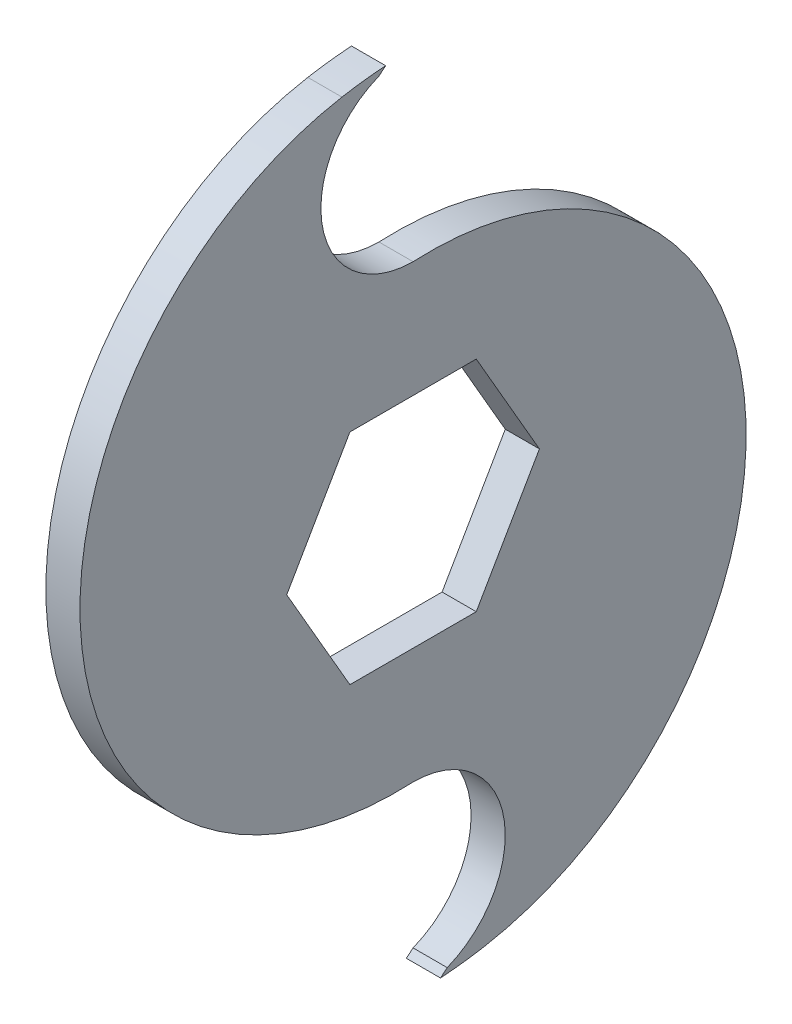
ISO-10303-21;
HEADER;
FILE_DESCRIPTION(('STEP AP214'),'2;1');
FILE_NAME('part.step','',(''),(''),'','','');
FILE_SCHEMA(('AUTOMOTIVE_DESIGN { 1 0 10303 214 1 1 1 1 }'));
ENDSEC;
DATA;
#1=APPLICATION_CONTEXT('core data for automotive mechanical design processes');
#2=APPLICATION_PROTOCOL_DEFINITION('international standard','automotive_design',2000,#1);
#3=PRODUCT_CONTEXT('',#1,'mechanical');
#4=PRODUCT('Part','Part','',(#3));
#5=PRODUCT_RELATED_PRODUCT_CATEGORY('part','',(#4));
#6=PRODUCT_DEFINITION_FORMATION('','',#4);
#7=PRODUCT_DEFINITION_CONTEXT('part definition',#1,'design');
#8=PRODUCT_DEFINITION('design','',#6,#7);
#9=PRODUCT_DEFINITION_SHAPE('','',#8);
#10=(LENGTH_UNIT() NAMED_UNIT(*) SI_UNIT(.MILLI.,.METRE.));
#11=(NAMED_UNIT(*) PLANE_ANGLE_UNIT() SI_UNIT($,.RADIAN.));
#12=(NAMED_UNIT(*) SI_UNIT($,.STERADIAN.) SOLID_ANGLE_UNIT());
#13=UNCERTAINTY_MEASURE_WITH_UNIT(LENGTH_MEASURE(1.E-05),#10,'distance_accuracy_value','');
#14=(GEOMETRIC_REPRESENTATION_CONTEXT(3) GLOBAL_UNCERTAINTY_ASSIGNED_CONTEXT((#13)) GLOBAL_UNIT_ASSIGNED_CONTEXT((#10,
#11,#12)) REPRESENTATION_CONTEXT('',''));
#15=CARTESIAN_POINT('',(0.,0.,0.));
#16=DIRECTION('',(0.,0.,1.));
#17=DIRECTION('',(1.,0.,0.));
#18=AXIS2_PLACEMENT_3D('',#15,#16,#17);
#19=CARTESIAN_POINT('',(5.,-6.68348162766741,-1.17847813602709));
#20=DIRECTION('',(1.,0.,0.));
#21=DIRECTION('',(0.,0.,-1.));
#22=AXIS2_PLACEMENT_3D('',#19,#20,#21);
#23=PLANE('',#22);
#24=CARTESIAN_POINT('',(5.,46.5,0.));
#25=DIRECTION('',(-1.,0.,0.));
#26=DIRECTION('',(0.,0.,-1.));
#27=AXIS2_PLACEMENT_3D('',#24,#25,#26);
#28=CIRCLE('',#27,13.5);
#29=CARTESIAN_POINT('',(5.,33.,0.));
#30=VERTEX_POINT('',#29);
#31=CARTESIAN_POINT('',(5.,59.0399362039844,5.00000000000001));
#32=VERTEX_POINT('',#31);
#33=EDGE_CURVE('E175',#30,#32,#28,.T.);
#34=ORIENTED_EDGE('',*,*,#33,.T.);
#35=DIRECTION('',(0.,0.642787609686539,-0.766044443118979));
#36=VECTOR('',#35,1.);
#37=CARTESIAN_POINT('',(5.,34.9269097415008,33.7367859149842));
#38=LINE('',#37,#36);
#39=CARTESIAN_POINT('',(5.,59.8654328102476,4.01621145381155));
#40=VERTEX_POINT('',#39);
#41=EDGE_CURVE('E164',#32,#40,#38,.T.);
#42=ORIENTED_EDGE('',*,*,#41,.T.);
#43=CARTESIAN_POINT('',(5.,0.,0.));
#44=DIRECTION('',(1.,0.,0.));
#45=DIRECTION('',(0.,0.,-1.));
#46=AXIS2_PLACEMENT_3D('',#43,#44,#45);
#47=CIRCLE('',#46,60.);
#48=CARTESIAN_POINT('',(5.,59.0884651807325,10.4188906600159));
#49=VERTEX_POINT('',#48);
#50=EDGE_CURVE('E178',#40,#49,#47,.T.);
#51=ORIENTED_EDGE('',*,*,#50,.T.);
#52=CARTESIAN_POINT('',(5.,13.3669632553348,2.3569562720542));
#53=DIRECTION('',(1.,0.,0.));
#54=DIRECTION('',(0.,0.,1.));
#55=AXIS2_PLACEMENT_3D('',#52,#53,#54);
#56=CIRCLE('',#55,46.4268297904341);
#57=CARTESIAN_POINT('',(5.,-33.,3.23881127922987E-13));
#58=VERTEX_POINT('',#57);
#59=EDGE_CURVE('E180',#49,#58,#56,.T.);
#60=ORIENTED_EDGE('',*,*,#59,.T.);
#61=CARTESIAN_POINT('',(5.,-46.5,3.24707764512411E-13));
#62=DIRECTION('',(-1.,0.,0.));
#63=DIRECTION('',(0.,0.,-1.));
#64=AXIS2_PLACEMENT_3D('',#61,#62,#63);
#65=CIRCLE('',#64,13.5);
#66=CARTESIAN_POINT('',(5.,-59.0399362039845,-4.99999999999959));
#67=VERTEX_POINT('',#66);
#68=EDGE_CURVE('E182',#58,#67,#65,.T.);
#69=ORIENTED_EDGE('',*,*,#68,.T.);
#70=DIRECTION('',(0.,-0.642787609686533,0.766044443118983));
#71=VECTOR('',#70,1.);
#72=CARTESIAN_POINT('',(5.,-39.2892425589387,-28.5379601077109));
#73=LINE('',#72,#71);
#74=CARTESIAN_POINT('',(5.,-59.8654328102477,-4.01621145381112));
#75=VERTEX_POINT('',#74);
#76=EDGE_CURVE('E158',#67,#75,#73,.T.);
#77=ORIENTED_EDGE('',*,*,#76,.T.);
#78=CARTESIAN_POINT('',(5.,0.,0.));
#79=DIRECTION('',(1.,0.,0.));
#80=DIRECTION('',(0.,0.,-1.));
#81=AXIS2_PLACEMENT_3D('',#78,#79,#80);
#82=CIRCLE('',#81,60.);
#83=CARTESIAN_POINT('',(5.,-59.0884651807325,-10.4188906600159));
#84=VERTEX_POINT('',#83);
#85=EDGE_CURVE('E170',#75,#84,#82,.T.);
#86=ORIENTED_EDGE('',*,*,#85,.T.);
#87=CARTESIAN_POINT('',(5.,-13.3669632553348,-2.35695627205419));
#88=DIRECTION('',(1.,0.,0.));
#89=DIRECTION('',(0.,0.,1.));
#90=AXIS2_PLACEMENT_3D('',#87,#88,#89);
#91=CIRCLE('',#90,46.4268297904341);
#92=EDGE_CURVE('E172',#84,#30,#91,.T.);
#93=ORIENTED_EDGE('',*,*,#92,.T.);
#94=EDGE_LOOP('',(#34,#42,#51,#60,#69,#77,#86,#93));
#95=FACE_BOUND('',#94,.T.);
#96=DIRECTION('',(0.,0.866025403784439,0.5));
#97=VECTOR('',#96,1.);
#98=CARTESIAN_POINT('',(5.,-13.5354072225526,10.6894051239956));
#99=LINE('',#98,#97);
#100=CARTESIAN_POINT('',(5.,-16.025,9.25203806376375));
#101=VERTEX_POINT('',#100);
#102=CARTESIAN_POINT('',(5.,0.,18.5040761275275));
#103=VERTEX_POINT('',#102);
#104=EDGE_CURVE('E149',#101,#103,#99,.T.);
#105=ORIENTED_EDGE('',*,*,#104,.T.);
#106=DIRECTION('',(0.,0.866025403784439,-0.5));
#107=VECTOR('',#106,1.);
#108=CARTESIAN_POINT('',(5.,3.51018478105142,16.4774699992821));
#109=LINE('',#108,#107);
#110=CARTESIAN_POINT('',(5.,16.025,9.25203806376373));
#111=VERTEX_POINT('',#110);
#112=EDGE_CURVE('E142',#103,#111,#109,.T.);
#113=ORIENTED_EDGE('',*,*,#112,.T.);
#114=DIRECTION('',(0.,0.,-1.));
#115=VECTOR('',#114,1.);
#116=CARTESIAN_POINT('',(5.,16.025,-1.17847813602709));
#117=LINE('',#116,#115);
#118=CARTESIAN_POINT('',(5.,16.025,-9.25203806376374));
#119=VERTEX_POINT('',#118);
#120=EDGE_CURVE('E131',#111,#119,#117,.T.);
#121=ORIENTED_EDGE('',*,*,#120,.T.);
#122=DIRECTION('',(0.,-0.866025403784439,-0.5));
#123=VECTOR('',#122,1.);
#124=CARTESIAN_POINT('',(5.,2.48959277744745,-17.0667090672957));
#125=LINE('',#124,#123);
#126=CARTESIAN_POINT('',(5.,0.,-18.5040761275275));
#127=VERTEX_POINT('',#126);
#128=EDGE_CURVE('E136',#119,#127,#125,.T.);
#129=ORIENTED_EDGE('',*,*,#128,.T.);
#130=DIRECTION('',(0.,-0.866025403784439,0.5));
#131=VECTOR('',#130,1.);
#132=CARTESIAN_POINT('',(5.,-12.5148152189486,-11.2786441920091));
#133=LINE('',#132,#131);
#134=CARTESIAN_POINT('',(5.,-16.025,-9.25203806376375));
#135=VERTEX_POINT('',#134);
#136=EDGE_CURVE('E245',#127,#135,#133,.T.);
#137=ORIENTED_EDGE('',*,*,#136,.T.);
#138=DIRECTION('',(0.,0.,1.));
#139=VECTOR('',#138,1.);
#140=CARTESIAN_POINT('',(5.,-16.025,-1.17847813602709));
#141=LINE('',#140,#139);
#142=EDGE_CURVE('E154',#135,#101,#141,.T.);
#143=ORIENTED_EDGE('',*,*,#142,.T.);
#144=EDGE_LOOP('',(#105,#113,#121,#129,#137,#143));
#145=FACE_BOUND('',#144,.T.);
#146=ADVANCED_FACE('F34',(#95,#145),#23,.T.);
#147=CARTESIAN_POINT('',(0.,-6.68348162766741,-1.17847813602709));
#148=DIRECTION('',(1.,0.,0.));
#149=DIRECTION('',(0.,0.,-1.));
#150=AXIS2_PLACEMENT_3D('',#147,#148,#149);
#151=PLANE('',#150);
#152=DIRECTION('',(0.,0.642787609686539,-0.766044443118979));
#153=VECTOR('',#152,1.);
#154=CARTESIAN_POINT('',(0.,34.9269097415008,33.7367859149842));
#155=LINE('',#154,#153);
#156=CARTESIAN_POINT('',(0.,59.0399362039845,5.));
#157=VERTEX_POINT('',#156);
#158=CARTESIAN_POINT('',(0.,59.8654328102476,4.01621145381154));
#159=VERTEX_POINT('',#158);
#160=EDGE_CURVE('E211',#157,#159,#155,.T.);
#161=ORIENTED_EDGE('',*,*,#160,.F.);
#162=CARTESIAN_POINT('',(0.,46.5,0.));
#163=DIRECTION('',(-1.,0.,0.));
#164=DIRECTION('',(0.,0.,-1.));
#165=AXIS2_PLACEMENT_3D('',#162,#163,#164);
#166=CIRCLE('',#165,13.5);
#167=CARTESIAN_POINT('',(0.,33.,0.));
#168=VERTEX_POINT('',#167);
#169=EDGE_CURVE('E189',#168,#157,#166,.T.);
#170=ORIENTED_EDGE('',*,*,#169,.F.);
#171=CARTESIAN_POINT('',(0.,-13.3669632553348,-2.35695627205419));
#172=DIRECTION('',(1.,0.,0.));
#173=DIRECTION('',(0.,0.,1.));
#174=AXIS2_PLACEMENT_3D('',#171,#172,#173);
#175=CIRCLE('',#174,46.4268297904341);
#176=CARTESIAN_POINT('',(0.,-59.0884651807325,-10.4188906600159));
#177=VERTEX_POINT('',#176);
#178=EDGE_CURVE('E187',#177,#168,#175,.T.);
#179=ORIENTED_EDGE('',*,*,#178,.F.);
#180=CARTESIAN_POINT('',(0.,0.,0.));
#181=DIRECTION('',(1.,0.,0.));
#182=DIRECTION('',(0.,0.,-1.));
#183=AXIS2_PLACEMENT_3D('',#180,#181,#182);
#184=CIRCLE('',#183,60.);
#185=CARTESIAN_POINT('',(0.,-59.8654328102476,-4.01621145381111));
#186=VERTEX_POINT('',#185);
#187=EDGE_CURVE('E169',#186,#177,#184,.T.);
#188=ORIENTED_EDGE('',*,*,#187,.F.);
#189=DIRECTION('',(0.,-0.642787609686533,0.766044443118983));
#190=VECTOR('',#189,1.);
#191=CARTESIAN_POINT('',(0.,-39.2892425589387,-28.5379601077109));
#192=LINE('',#191,#190);
#193=CARTESIAN_POINT('',(0.,-59.0399362039845,-4.99999999999958));
#194=VERTEX_POINT('',#193);
#195=EDGE_CURVE('E209',#194,#186,#192,.T.);
#196=ORIENTED_EDGE('',*,*,#195,.F.);
#197=CARTESIAN_POINT('',(0.,-46.5,3.24707764512411E-13));
#198=DIRECTION('',(-1.,0.,0.));
#199=DIRECTION('',(0.,0.,-1.));
#200=AXIS2_PLACEMENT_3D('',#197,#198,#199);
#201=CIRCLE('',#200,13.5);
#202=CARTESIAN_POINT('',(0.,-33.,3.23881127922987E-13));
#203=VERTEX_POINT('',#202);
#204=EDGE_CURVE('E173',#203,#194,#201,.T.);
#205=ORIENTED_EDGE('',*,*,#204,.F.);
#206=CARTESIAN_POINT('',(0.,13.3669632553348,2.3569562720542));
#207=DIRECTION('',(1.,0.,0.));
#208=DIRECTION('',(0.,0.,1.));
#209=AXIS2_PLACEMENT_3D('',#206,#207,#208);
#210=CIRCLE('',#209,46.4268297904341);
#211=CARTESIAN_POINT('',(0.,59.0884651807325,10.4188906600159));
#212=VERTEX_POINT('',#211);
#213=EDGE_CURVE('E194',#212,#203,#210,.T.);
#214=ORIENTED_EDGE('',*,*,#213,.F.);
#215=CARTESIAN_POINT('',(0.,0.,0.));
#216=DIRECTION('',(1.,0.,0.));
#217=DIRECTION('',(0.,0.,-1.));
#218=AXIS2_PLACEMENT_3D('',#215,#216,#217);
#219=CIRCLE('',#218,60.);
#220=EDGE_CURVE('E192',#159,#212,#219,.T.);
#221=ORIENTED_EDGE('',*,*,#220,.F.);
#222=EDGE_LOOP('',(#161,#170,#179,#188,#196,#205,#214,#221));
#223=FACE_BOUND('',#222,.T.);
#224=DIRECTION('',(0.,0.866025403784439,-0.5));
#225=VECTOR('',#224,1.);
#226=CARTESIAN_POINT('',(0.,3.51018478105142,16.4774699992821));
#227=LINE('',#226,#225);
#228=CARTESIAN_POINT('',(0.,0.,18.5040761275275));
#229=VERTEX_POINT('',#228);
#230=CARTESIAN_POINT('',(0.,16.025,9.25203806376373));
#231=VERTEX_POINT('',#230);
#232=EDGE_CURVE('E11',#229,#231,#227,.T.);
#233=ORIENTED_EDGE('',*,*,#232,.F.);
#234=DIRECTION('',(0.,0.866025403784439,0.5));
#235=VECTOR('',#234,1.);
#236=CARTESIAN_POINT('',(0.,-13.5354072225526,10.6894051239956));
#237=LINE('',#236,#235);
#238=CARTESIAN_POINT('',(0.,-16.025,9.25203806376375));
#239=VERTEX_POINT('',#238);
#240=EDGE_CURVE('E42',#239,#229,#237,.T.);
#241=ORIENTED_EDGE('',*,*,#240,.F.);
#242=DIRECTION('',(0.,0.,1.));
#243=VECTOR('',#242,1.);
#244=CARTESIAN_POINT('',(0.,-16.025,-1.17847813602709));
#245=LINE('',#244,#243);
#246=CARTESIAN_POINT('',(0.,-16.025,-9.25203806376375));
#247=VERTEX_POINT('',#246);
#248=EDGE_CURVE('E219',#247,#239,#245,.T.);
#249=ORIENTED_EDGE('',*,*,#248,.F.);
#250=DIRECTION('',(0.,-0.866025403784439,0.5));
#251=VECTOR('',#250,1.);
#252=CARTESIAN_POINT('',(0.,-12.5148152189486,-11.2786441920091));
#253=LINE('',#252,#251);
#254=CARTESIAN_POINT('',(0.,0.,-18.5040761275275));
#255=VERTEX_POINT('',#254);
#256=EDGE_CURVE('E217',#255,#247,#253,.T.);
#257=ORIENTED_EDGE('',*,*,#256,.F.);
#258=DIRECTION('',(0.,-0.866025403784439,-0.5));
#259=VECTOR('',#258,1.);
#260=CARTESIAN_POINT('',(0.,2.48959277744745,-17.0667090672957));
#261=LINE('',#260,#259);
#262=CARTESIAN_POINT('',(0.,16.025,-9.25203806376374));
#263=VERTEX_POINT('',#262);
#264=EDGE_CURVE('E215',#263,#255,#261,.T.);
#265=ORIENTED_EDGE('',*,*,#264,.F.);
#266=DIRECTION('',(0.,0.,-1.));
#267=VECTOR('',#266,1.);
#268=CARTESIAN_POINT('',(0.,16.025,-1.17847813602709));
#269=LINE('',#268,#267);
#270=EDGE_CURVE('E213',#231,#263,#269,.T.);
#271=ORIENTED_EDGE('',*,*,#270,.F.);
#272=EDGE_LOOP('',(#233,#241,#249,#257,#265,#271));
#273=FACE_BOUND('',#272,.T.);
#274=ADVANCED_FACE('F229',(#223,#273),#151,.F.);
#275=CARTESIAN_POINT('',(5.,0.,0.));
#276=DIRECTION('',(-1.,0.,0.));
#277=DIRECTION('',(0.,0.,1.));
#278=AXIS2_PLACEMENT_3D('',#275,#276,#277);
#279=CYLINDRICAL_SURFACE('',#278,60.);
#280=DIRECTION('',(-1.,0.,0.));
#281=VECTOR('',#280,1.);
#282=CARTESIAN_POINT('',(5.,-59.8654328102477,-4.01621145381108));
#283=LINE('',#282,#281);
#284=EDGE_CURVE('E162',#186,#75,#283,.F.);
#285=ORIENTED_EDGE('',*,*,#284,.F.);
#286=ORIENTED_EDGE('',*,*,#187,.T.);
#287=DIRECTION('',(-1.,0.,0.));
#288=VECTOR('',#287,1.);
#289=CARTESIAN_POINT('',(5.,-59.0884651807325,-10.4188906600159));
#290=LINE('',#289,#288);
#291=EDGE_CURVE('E206',#84,#177,#290,.T.);
#292=ORIENTED_EDGE('',*,*,#291,.F.);
#293=ORIENTED_EDGE('',*,*,#85,.F.);
#294=EDGE_LOOP('',(#285,#286,#292,#293));
#295=FACE_BOUND('',#294,.T.);
#296=ADVANCED_FACE('F36',(#295),#279,.T.);
#297=CARTESIAN_POINT('',(5.,46.5,0.));
#298=DIRECTION('',(-1.,0.,0.));
#299=DIRECTION('',(0.,0.,1.));
#300=AXIS2_PLACEMENT_3D('',#297,#298,#299);
#301=CYLINDRICAL_SURFACE('',#300,13.5);
#302=DIRECTION('',(-1.,0.,0.));
#303=VECTOR('',#302,1.);
#304=CARTESIAN_POINT('',(6.,59.0399362039844,5.00000000000001));
#305=LINE('',#304,#303);
#306=EDGE_CURVE('E152',#32,#157,#305,.T.);
#307=ORIENTED_EDGE('',*,*,#306,.F.);
#308=ORIENTED_EDGE('',*,*,#33,.F.);
#309=DIRECTION('',(-1.,0.,0.));
#310=VECTOR('',#309,1.);
#311=CARTESIAN_POINT('',(5.,33.,0.));
#312=LINE('',#311,#310);
#313=EDGE_CURVE('E203',#30,#168,#312,.T.);
#314=ORIENTED_EDGE('',*,*,#313,.T.);
#315=ORIENTED_EDGE('',*,*,#169,.T.);
#316=EDGE_LOOP('',(#307,#308,#314,#315));
#317=FACE_BOUND('',#316,.T.);
#318=ADVANCED_FACE('F285',(#317),#301,.F.);
#319=CARTESIAN_POINT('',(5.,0.,0.));
#320=DIRECTION('',(-1.,0.,0.));
#321=DIRECTION('',(0.,0.,1.));
#322=AXIS2_PLACEMENT_3D('',#319,#320,#321);
#323=CYLINDRICAL_SURFACE('',#322,60.);
#324=DIRECTION('',(-1.,0.,0.));
#325=VECTOR('',#324,1.);
#326=CARTESIAN_POINT('',(5.,59.8654328102476,4.01621145381155));
#327=LINE('',#326,#325);
#328=EDGE_CURVE('E167',#159,#40,#327,.F.);
#329=ORIENTED_EDGE('',*,*,#328,.F.);
#330=ORIENTED_EDGE('',*,*,#220,.T.);
#331=DIRECTION('',(-1.,0.,0.));
#332=VECTOR('',#331,1.);
#333=CARTESIAN_POINT('',(5.,59.0884651807325,10.4188906600159));
#334=LINE('',#333,#332);
#335=EDGE_CURVE('E200',#49,#212,#334,.T.);
#336=ORIENTED_EDGE('',*,*,#335,.F.);
#337=ORIENTED_EDGE('',*,*,#50,.F.);
#338=EDGE_LOOP('',(#329,#330,#336,#337));
#339=FACE_BOUND('',#338,.T.);
#340=ADVANCED_FACE('F277',(#339),#323,.T.);
#341=CARTESIAN_POINT('',(5.,-46.5,3.24707764512411E-13));
#342=DIRECTION('',(-1.,0.,0.));
#343=DIRECTION('',(0.,0.,1.));
#344=AXIS2_PLACEMENT_3D('',#341,#342,#343);
#345=CYLINDRICAL_SURFACE('',#344,13.5);
#346=DIRECTION('',(-1.,0.,0.));
#347=VECTOR('',#346,1.);
#348=CARTESIAN_POINT('',(6.,-59.0399362039845,-4.99999999999959));
#349=LINE('',#348,#347);
#350=EDGE_CURVE('E150',#67,#194,#349,.T.);
#351=ORIENTED_EDGE('',*,*,#350,.F.);
#352=ORIENTED_EDGE('',*,*,#68,.F.);
#353=DIRECTION('',(-1.,0.,0.));
#354=VECTOR('',#353,1.);
#355=CARTESIAN_POINT('',(5.,-33.,3.23881127922987E-13));
#356=LINE('',#355,#354);
#357=EDGE_CURVE('E185',#58,#203,#356,.T.);
#358=ORIENTED_EDGE('',*,*,#357,.T.);
#359=ORIENTED_EDGE('',*,*,#204,.T.);
#360=EDGE_LOOP('',(#351,#352,#358,#359));
#361=FACE_BOUND('',#360,.T.);
#362=ADVANCED_FACE('F273',(#361),#345,.F.);
#363=CARTESIAN_POINT('',(5.,-13.3669632553348,-2.35695627205419));
#364=DIRECTION('',(-1.,0.,0.));
#365=DIRECTION('',(0.,0.,1.));
#366=AXIS2_PLACEMENT_3D('',#363,#364,#365);
#367=CYLINDRICAL_SURFACE('',#366,46.4268297904341);
#368=ORIENTED_EDGE('',*,*,#178,.T.);
#369=ORIENTED_EDGE('',*,*,#313,.F.);
#370=ORIENTED_EDGE('',*,*,#92,.F.);
#371=ORIENTED_EDGE('',*,*,#291,.T.);
#372=EDGE_LOOP('',(#368,#369,#370,#371));
#373=FACE_BOUND('',#372,.T.);
#374=ADVANCED_FACE('F276',(#373),#367,.T.);
#375=CARTESIAN_POINT('',(5.,13.3669632553348,2.3569562720542));
#376=DIRECTION('',(-1.,0.,0.));
#377=DIRECTION('',(0.,0.,1.));
#378=AXIS2_PLACEMENT_3D('',#375,#376,#377);
#379=CYLINDRICAL_SURFACE('',#378,46.4268297904341);
#380=ORIENTED_EDGE('',*,*,#213,.T.);
#381=ORIENTED_EDGE('',*,*,#357,.F.);
#382=ORIENTED_EDGE('',*,*,#59,.F.);
#383=ORIENTED_EDGE('',*,*,#335,.T.);
#384=EDGE_LOOP('',(#380,#381,#382,#383));
#385=FACE_BOUND('',#384,.T.);
#386=ADVANCED_FACE('F279',(#385),#379,.T.);
#387=CARTESIAN_POINT('',(6.,-59.0399362039845,-4.99999999999959));
#388=DIRECTION('',(0.,0.766044443118983,0.642787609686533));
#389=DIRECTION('',(0.,-0.642787609686533,0.766044443118983));
#390=AXIS2_PLACEMENT_3D('',#387,#388,#389);
#391=PLANE('',#390);
#392=ORIENTED_EDGE('',*,*,#284,.T.);
#393=ORIENTED_EDGE('',*,*,#76,.F.);
#394=ORIENTED_EDGE('',*,*,#350,.T.);
#395=ORIENTED_EDGE('',*,*,#195,.T.);
#396=EDGE_LOOP('',(#392,#393,#394,#395));
#397=FACE_BOUND('',#396,.T.);
#398=ADVANCED_FACE('F270',(#397),#391,.T.);
#399=CARTESIAN_POINT('',(6.,59.0399362039844,5.00000000000001));
#400=DIRECTION('',(0.,-0.766044443118979,-0.642787609686539));
#401=DIRECTION('',(0.,0.642787609686539,-0.766044443118979));
#402=AXIS2_PLACEMENT_3D('',#399,#400,#401);
#403=PLANE('',#402);
#404=ORIENTED_EDGE('',*,*,#328,.T.);
#405=ORIENTED_EDGE('',*,*,#41,.F.);
#406=ORIENTED_EDGE('',*,*,#306,.T.);
#407=ORIENTED_EDGE('',*,*,#160,.T.);
#408=EDGE_LOOP('',(#404,#405,#406,#407));
#409=FACE_BOUND('',#408,.T.);
#410=ADVANCED_FACE('F306',(#409),#403,.T.);
#411=CARTESIAN_POINT('',(148.5,16.025,9.25203806376373));
#412=DIRECTION('',(0.,-0.5,-0.866025403784439));
#413=DIRECTION('',(0.,0.866025403784439,-0.5));
#414=AXIS2_PLACEMENT_3D('',#411,#412,#413);
#415=PLANE('',#414);
#416=DIRECTION('',(-1.,0.,0.));
#417=VECTOR('',#416,1.);
#418=CARTESIAN_POINT('',(148.5,0.,18.5040761275275));
#419=LINE('',#418,#417);
#420=EDGE_CURVE('E137',#103,#229,#419,.T.);
#421=ORIENTED_EDGE('',*,*,#420,.T.);
#422=ORIENTED_EDGE('',*,*,#232,.T.);
#423=DIRECTION('',(-1.,0.,0.));
#424=VECTOR('',#423,1.);
#425=CARTESIAN_POINT('',(148.5,16.025,9.25203806376373));
#426=LINE('',#425,#424);
#427=EDGE_CURVE('E54',#111,#231,#426,.T.);
#428=ORIENTED_EDGE('',*,*,#427,.F.);
#429=ORIENTED_EDGE('',*,*,#112,.F.);
#430=EDGE_LOOP('',(#421,#422,#428,#429));
#431=FACE_BOUND('',#430,.T.);
#432=ADVANCED_FACE('F141',(#431),#415,.T.);
#433=CARTESIAN_POINT('',(148.5,0.,18.5040761275275));
#434=DIRECTION('',(0.,0.5,-0.866025403784439));
#435=DIRECTION('',(0.,0.866025403784439,0.5));
#436=AXIS2_PLACEMENT_3D('',#433,#434,#435);
#437=PLANE('',#436);
#438=DIRECTION('',(-1.,0.,0.));
#439=VECTOR('',#438,1.);
#440=CARTESIAN_POINT('',(148.5,-16.025,9.25203806376375));
#441=LINE('',#440,#439);
#442=EDGE_CURVE('E225',#101,#239,#441,.T.);
#443=ORIENTED_EDGE('',*,*,#442,.T.);
#444=ORIENTED_EDGE('',*,*,#240,.T.);
#445=ORIENTED_EDGE('',*,*,#420,.F.);
#446=ORIENTED_EDGE('',*,*,#104,.F.);
#447=EDGE_LOOP('',(#443,#444,#445,#446));
#448=FACE_BOUND('',#447,.T.);
#449=ADVANCED_FACE('F223',(#448),#437,.T.);
#450=CARTESIAN_POINT('',(148.5,-16.025,9.25203806376375));
#451=DIRECTION('',(0.,1.,0.));
#452=DIRECTION('',(0.,0.,1.));
#453=AXIS2_PLACEMENT_3D('',#450,#451,#452);
#454=PLANE('',#453);
#455=DIRECTION('',(-1.,0.,0.));
#456=VECTOR('',#455,1.);
#457=CARTESIAN_POINT('',(148.5,-16.025,-9.25203806376375));
#458=LINE('',#457,#456);
#459=EDGE_CURVE('E238',#135,#247,#458,.T.);
#460=ORIENTED_EDGE('',*,*,#459,.T.);
#461=ORIENTED_EDGE('',*,*,#248,.T.);
#462=ORIENTED_EDGE('',*,*,#442,.F.);
#463=ORIENTED_EDGE('',*,*,#142,.F.);
#464=EDGE_LOOP('',(#460,#461,#462,#463));
#465=FACE_BOUND('',#464,.T.);
#466=ADVANCED_FACE('F249',(#465),#454,.T.);
#467=CARTESIAN_POINT('',(148.5,-16.025,-9.25203806376375));
#468=DIRECTION('',(0.,0.5,0.866025403784439));
#469=DIRECTION('',(0.,-0.866025403784439,0.5));
#470=AXIS2_PLACEMENT_3D('',#467,#468,#469);
#471=PLANE('',#470);
#472=DIRECTION('',(-1.,0.,0.));
#473=VECTOR('',#472,1.);
#474=CARTESIAN_POINT('',(148.5,0.,-18.5040761275275));
#475=LINE('',#474,#473);
#476=EDGE_CURVE('E236',#127,#255,#475,.T.);
#477=ORIENTED_EDGE('',*,*,#476,.T.);
#478=ORIENTED_EDGE('',*,*,#256,.T.);
#479=ORIENTED_EDGE('',*,*,#459,.F.);
#480=ORIENTED_EDGE('',*,*,#136,.F.);
#481=EDGE_LOOP('',(#477,#478,#479,#480));
#482=FACE_BOUND('',#481,.T.);
#483=ADVANCED_FACE('F251',(#482),#471,.T.);
#484=CARTESIAN_POINT('',(148.5,0.,-18.5040761275275));
#485=DIRECTION('',(0.,-0.5,0.866025403784439));
#486=DIRECTION('',(0.,-0.866025403784439,-0.5));
#487=AXIS2_PLACEMENT_3D('',#484,#485,#486);
#488=PLANE('',#487);
#489=DIRECTION('',(-1.,0.,0.));
#490=VECTOR('',#489,1.);
#491=CARTESIAN_POINT('',(148.5,16.025,-9.25203806376374));
#492=LINE('',#491,#490);
#493=EDGE_CURVE('E49',#119,#263,#492,.T.);
#494=ORIENTED_EDGE('',*,*,#493,.T.);
#495=ORIENTED_EDGE('',*,*,#264,.T.);
#496=ORIENTED_EDGE('',*,*,#476,.F.);
#497=ORIENTED_EDGE('',*,*,#128,.F.);
#498=EDGE_LOOP('',(#494,#495,#496,#497));
#499=FACE_BOUND('',#498,.T.);
#500=ADVANCED_FACE('F233',(#499),#488,.T.);
#501=CARTESIAN_POINT('',(148.5,16.025,-9.25203806376374));
#502=DIRECTION('',(0.,-1.,0.));
#503=DIRECTION('',(0.,0.,-1.));
#504=AXIS2_PLACEMENT_3D('',#501,#502,#503);
#505=PLANE('',#504);
#506=ORIENTED_EDGE('',*,*,#427,.T.);
#507=ORIENTED_EDGE('',*,*,#270,.T.);
#508=ORIENTED_EDGE('',*,*,#493,.F.);
#509=ORIENTED_EDGE('',*,*,#120,.F.);
#510=EDGE_LOOP('',(#506,#507,#508,#509));
#511=FACE_BOUND('',#510,.T.);
#512=ADVANCED_FACE('F132',(#511),#505,.T.);
#513=CLOSED_SHELL('',(#146,#274,#296,#318,#340,#362,#374,#386,#398,#410,#432,#449,#466,#483,
#500,#512));
#514=MANIFOLD_SOLID_BREP('B2',#513);
#515=ADVANCED_BREP_SHAPE_REPRESENTATION('',(#18,#514),#14);
#516=SHAPE_DEFINITION_REPRESENTATION(#9,#515);
ENDSEC;
END-ISO-10303-21;
